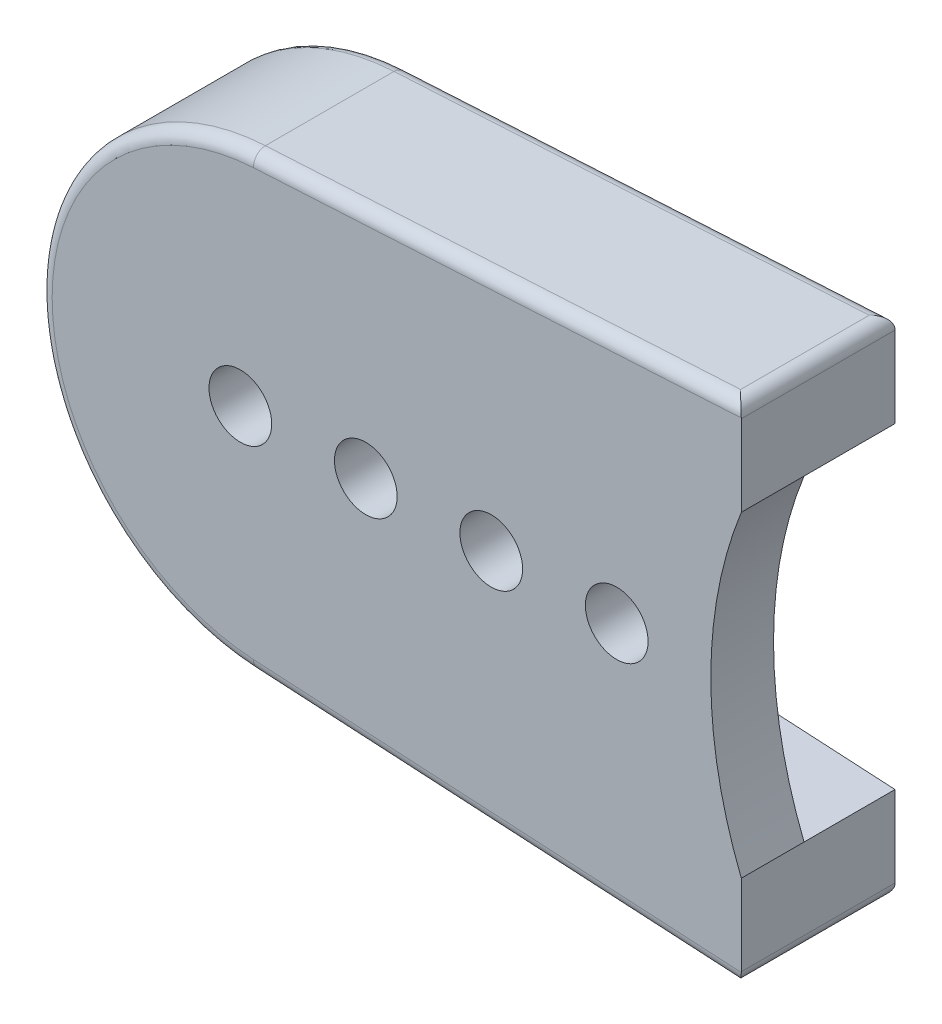
ISO-10303-21;
HEADER;
FILE_DESCRIPTION(('STEP AP214'),'2;1');
FILE_NAME('part.step','',(''),(''),'','','');
FILE_SCHEMA(('AUTOMOTIVE_DESIGN { 1 0 10303 214 1 1 1 1 }'));
ENDSEC;
DATA;
#1=APPLICATION_CONTEXT('core data for automotive mechanical design processes');
#2=APPLICATION_PROTOCOL_DEFINITION('international standard','automotive_design',2000,#1);
#3=PRODUCT_CONTEXT('',#1,'mechanical');
#4=PRODUCT('Part','Part','',(#3));
#5=PRODUCT_RELATED_PRODUCT_CATEGORY('part','',(#4));
#6=PRODUCT_DEFINITION_FORMATION('','',#4);
#7=PRODUCT_DEFINITION_CONTEXT('part definition',#1,'design');
#8=PRODUCT_DEFINITION('design','',#6,#7);
#9=PRODUCT_DEFINITION_SHAPE('','',#8);
#10=(LENGTH_UNIT() NAMED_UNIT(*) SI_UNIT(.MILLI.,.METRE.));
#11=(NAMED_UNIT(*) PLANE_ANGLE_UNIT() SI_UNIT($,.RADIAN.));
#12=(NAMED_UNIT(*) SI_UNIT($,.STERADIAN.) SOLID_ANGLE_UNIT());
#13=UNCERTAINTY_MEASURE_WITH_UNIT(LENGTH_MEASURE(1.E-05),#10,'distance_accuracy_value','');
#14=(GEOMETRIC_REPRESENTATION_CONTEXT(3) GLOBAL_UNCERTAINTY_ASSIGNED_CONTEXT((#13)) GLOBAL_UNIT_ASSIGNED_CONTEXT((#10,
#11,#12)) REPRESENTATION_CONTEXT('',''));
#15=CARTESIAN_POINT('',(0.,0.,0.));
#16=DIRECTION('',(0.,0.,1.));
#17=DIRECTION('',(1.,0.,0.));
#18=AXIS2_PLACEMENT_3D('',#15,#16,#17);
#19=CARTESIAN_POINT('',(0.,0.,1.));
#20=DIRECTION('',(0.,0.,1.));
#21=DIRECTION('',(1.,0.,0.));
#22=AXIS2_PLACEMENT_3D('',#19,#20,#21);
#23=PLANE('',#22);
#24=CARTESIAN_POINT('',(-12.3,0.,1.));
#25=DIRECTION('',(0.,0.,1.));
#26=DIRECTION('',(1.,0.,0.));
#27=AXIS2_PLACEMENT_3D('',#24,#25,#26);
#28=CIRCLE('',#27,0.500000000000001);
#29=CARTESIAN_POINT('',(-11.8,0.,1.));
#30=VERTEX_POINT('',#29);
#31=EDGE_CURVE('E274',#30,#30,#28,.T.);
#32=ORIENTED_EDGE('',*,*,#31,.F.);
#33=EDGE_LOOP('',(#32));
#34=FACE_BOUND('',#33,.T.);
#35=CARTESIAN_POINT('',(-8.3,0.,1.));
#36=DIRECTION('',(0.,0.,1.));
#37=DIRECTION('',(1.,0.,0.));
#38=AXIS2_PLACEMENT_3D('',#35,#36,#37);
#39=CIRCLE('',#38,0.500000000000001);
#40=CARTESIAN_POINT('',(-7.8,0.,1.));
#41=VERTEX_POINT('',#40);
#42=EDGE_CURVE('E286',#41,#41,#39,.T.);
#43=ORIENTED_EDGE('',*,*,#42,.F.);
#44=EDGE_LOOP('',(#43));
#45=FACE_BOUND('',#44,.T.);
#46=DIRECTION('',(0.998452256545436,-0.0556155679583174,0.));
#47=VECTOR('',#46,1.);
#48=CARTESIAN_POINT('',(-0.232086901508914,-4.16659757390032,1.));
#49=LINE('',#48,#47);
#50=CARTESIAN_POINT('',(-14.0890929310583,-3.39473767225448,1.));
#51=VERTEX_POINT('',#50);
#52=CARTESIAN_POINT('',(-6.31379868961076,-3.82783540171158,1.));
#53=VERTEX_POINT('',#52);
#54=EDGE_CURVE('E182',#51,#53,#49,.T.);
#55=ORIENTED_EDGE('',*,*,#54,.T.);
#56=CARTESIAN_POINT('',(-6.51348914091985,-3.81671228811991,1.));
#57=DIRECTION('',(0.,0.,1.));
#58=DIRECTION('',(1.,0.,0.));
#59=AXIS2_PLACEMENT_3D('',#56,#57,#58);
#60=CIRCLE('',#59,0.2);
#61=CARTESIAN_POINT('',(-6.31348914091985,-3.81671228811991,1.));
#62=VERTEX_POINT('',#61);
#63=EDGE_CURVE('E184',#53,#62,#60,.T.);
#64=ORIENTED_EDGE('',*,*,#63,.T.);
#65=DIRECTION('',(0.,-1.,0.));
#66=VECTOR('',#65,1.);
#67=CARTESIAN_POINT('',(-6.31348914091985,0.,1.));
#68=LINE('',#67,#66);
#69=CARTESIAN_POINT('',(-6.31348914091985,-2.52583745864359,1.));
#70=VERTEX_POINT('',#69);
#71=EDGE_CURVE('E162',#70,#62,#68,.T.);
#72=ORIENTED_EDGE('',*,*,#71,.F.);
#73=CARTESIAN_POINT('',(0.,0.,1.));
#74=DIRECTION('',(0.,0.,-1.));
#75=DIRECTION('',(1.,0.,0.));
#76=AXIS2_PLACEMENT_3D('',#73,#74,#75);
#77=CIRCLE('',#76,6.8);
#78=CARTESIAN_POINT('',(-6.31348914091985,2.52583745864359,1.));
#79=VERTEX_POINT('',#78);
#80=EDGE_CURVE('E158',#70,#79,#77,.T.);
#81=ORIENTED_EDGE('',*,*,#80,.T.);
#82=DIRECTION('',(0.,1.,0.));
#83=VECTOR('',#82,1.);
#84=CARTESIAN_POINT('',(-6.31348914091985,0.,1.));
#85=LINE('',#84,#83);
#86=CARTESIAN_POINT('',(-6.31348914091985,3.81671228811991,1.));
#87=VERTEX_POINT('',#86);
#88=EDGE_CURVE('E142',#79,#87,#85,.T.);
#89=ORIENTED_EDGE('',*,*,#88,.T.);
#90=CARTESIAN_POINT('',(-6.51348914091985,3.81671228811991,1.));
#91=DIRECTION('',(0.,0.,1.));
#92=DIRECTION('',(1.,0.,0.));
#93=AXIS2_PLACEMENT_3D('',#90,#91,#92);
#94=CIRCLE('',#93,0.2);
#95=CARTESIAN_POINT('',(-6.31379868961076,3.82783540171157,1.));
#96=VERTEX_POINT('',#95);
#97=EDGE_CURVE('E172',#87,#96,#94,.T.);
#98=ORIENTED_EDGE('',*,*,#97,.T.);
#99=DIRECTION('',(-0.998452256545436,-0.0556155679583176,0.));
#100=VECTOR('',#99,1.);
#101=CARTESIAN_POINT('',(-0.232086901508914,4.16659757390031,1.));
#102=LINE('',#101,#100);
#103=CARTESIAN_POINT('',(-14.0890929310583,3.39473767225448,1.));
#104=VERTEX_POINT('',#103);
#105=EDGE_CURVE('E174',#96,#104,#102,.T.);
#106=ORIENTED_EDGE('',*,*,#105,.T.);
#107=CARTESIAN_POINT('',(-13.9,0.,1.));
#108=DIRECTION('',(0.,0.,1.));
#109=DIRECTION('',(1.,0.,0.));
#110=AXIS2_PLACEMENT_3D('',#107,#108,#109);
#111=CIRCLE('',#110,3.4);
#112=EDGE_CURVE('E180',#104,#51,#111,.T.);
#113=ORIENTED_EDGE('',*,*,#112,.T.);
#114=EDGE_LOOP('',(#55,#64,#72,#81,#89,#98,#106,#113));
#115=FACE_BOUND('',#114,.T.);
#116=CARTESIAN_POINT('',(-10.3,0.,1.));
#117=DIRECTION('',(0.,0.,1.));
#118=DIRECTION('',(1.,0.,0.));
#119=AXIS2_PLACEMENT_3D('',#116,#117,#118);
#120=CIRCLE('',#119,0.500000000000001);
#121=CARTESIAN_POINT('',(-9.8,0.,1.));
#122=VERTEX_POINT('',#121);
#123=EDGE_CURVE('E280',#122,#122,#120,.T.);
#124=ORIENTED_EDGE('',*,*,#123,.F.);
#125=EDGE_LOOP('',(#124));
#126=FACE_BOUND('',#125,.T.);
#127=CARTESIAN_POINT('',(-14.3,0.,1.));
#128=DIRECTION('',(0.,0.,1.));
#129=DIRECTION('',(1.,0.,0.));
#130=AXIS2_PLACEMENT_3D('',#127,#128,#129);
#131=CIRCLE('',#130,0.500000000000001);
#132=CARTESIAN_POINT('',(-13.8,0.,1.));
#133=VERTEX_POINT('',#132);
#134=EDGE_CURVE('E268',#133,#133,#131,.T.);
#135=ORIENTED_EDGE('',*,*,#134,.F.);
#136=EDGE_LOOP('',(#135));
#137=FACE_BOUND('',#136,.T.);
#138=ADVANCED_FACE('F37',(#34,#45,#115,#126,#137),#23,.T.);
#139=CARTESIAN_POINT('',(0.,0.,0.));
#140=DIRECTION('',(0.,0.,1.));
#141=DIRECTION('',(1.,0.,0.));
#142=AXIS2_PLACEMENT_3D('',#139,#140,#141);
#143=PLANE('',#142);
#144=CARTESIAN_POINT('',(0.,0.,0.));
#145=DIRECTION('',(0.,0.,-1.));
#146=DIRECTION('',(1.,0.,0.));
#147=AXIS2_PLACEMENT_3D('',#144,#145,#146);
#148=CIRCLE('',#147,6.8);
#149=CARTESIAN_POINT('',(-6.31348914091985,-2.52583745864359,0.));
#150=VERTEX_POINT('',#149);
#151=CARTESIAN_POINT('',(-6.31348914091985,2.52583745864359,0.));
#152=VERTEX_POINT('',#151);
#153=EDGE_CURVE('E171',#150,#152,#148,.T.);
#154=ORIENTED_EDGE('',*,*,#153,.F.);
#155=DIRECTION('',(0.998452256545436,-0.0556155679583174,0.));
#156=VECTOR('',#155,1.);
#157=CARTESIAN_POINT('',(-14.0167926927125,-2.09674973874542,0.));
#158=LINE('',#157,#156);
#159=CARTESIAN_POINT('',(-14.0167926927125,-2.09674973874542,0.));
#160=VERTEX_POINT('',#159);
#161=EDGE_CURVE('E166',#160,#150,#158,.T.);
#162=ORIENTED_EDGE('',*,*,#161,.F.);
#163=CARTESIAN_POINT('',(-13.9,0.,0.));
#164=DIRECTION('',(0.,0.,1.));
#165=DIRECTION('',(1.,0.,0.));
#166=AXIS2_PLACEMENT_3D('',#163,#164,#165);
#167=CIRCLE('',#166,2.1);
#168=CARTESIAN_POINT('',(-14.0167926927125,2.09674973874541,0.));
#169=VERTEX_POINT('',#168);
#170=EDGE_CURVE('E294',#169,#160,#167,.T.);
#171=ORIENTED_EDGE('',*,*,#170,.F.);
#172=DIRECTION('',(-0.998452256545436,-0.0556155679583176,0.));
#173=VECTOR('',#172,1.);
#174=CARTESIAN_POINT('',(-6.31348914091985,2.52583745864359,0.));
#175=LINE('',#174,#173);
#176=EDGE_CURVE('E292',#152,#169,#175,.T.);
#177=ORIENTED_EDGE('',*,*,#176,.F.);
#178=EDGE_LOOP('',(#154,#162,#171,#177));
#179=FACE_BOUND('',#178,.T.);
#180=CARTESIAN_POINT('',(-8.3,0.,0.));
#181=DIRECTION('',(0.,0.,1.));
#182=DIRECTION('',(1.,0.,0.));
#183=AXIS2_PLACEMENT_3D('',#180,#181,#182);
#184=CIRCLE('',#183,0.500000000000001);
#185=CARTESIAN_POINT('',(-7.8,0.,0.));
#186=VERTEX_POINT('',#185);
#187=EDGE_CURVE('E283',#186,#186,#184,.T.);
#188=ORIENTED_EDGE('',*,*,#187,.T.);
#189=EDGE_LOOP('',(#188));
#190=FACE_BOUND('',#189,.T.);
#191=CARTESIAN_POINT('',(-10.3,0.,0.));
#192=DIRECTION('',(0.,0.,1.));
#193=DIRECTION('',(1.,0.,0.));
#194=AXIS2_PLACEMENT_3D('',#191,#192,#193);
#195=CIRCLE('',#194,0.500000000000001);
#196=CARTESIAN_POINT('',(-9.8,0.,0.));
#197=VERTEX_POINT('',#196);
#198=EDGE_CURVE('E277',#197,#197,#195,.T.);
#199=ORIENTED_EDGE('',*,*,#198,.T.);
#200=EDGE_LOOP('',(#199));
#201=FACE_BOUND('',#200,.T.);
#202=CARTESIAN_POINT('',(-12.3,0.,0.));
#203=DIRECTION('',(0.,0.,1.));
#204=DIRECTION('',(1.,0.,0.));
#205=AXIS2_PLACEMENT_3D('',#202,#203,#204);
#206=CIRCLE('',#205,0.500000000000001);
#207=CARTESIAN_POINT('',(-11.8,0.,0.));
#208=VERTEX_POINT('',#207);
#209=EDGE_CURVE('E271',#208,#208,#206,.T.);
#210=ORIENTED_EDGE('',*,*,#209,.T.);
#211=EDGE_LOOP('',(#210));
#212=FACE_BOUND('',#211,.T.);
#213=CARTESIAN_POINT('',(-14.3,0.,0.));
#214=DIRECTION('',(0.,0.,1.));
#215=DIRECTION('',(1.,0.,0.));
#216=AXIS2_PLACEMENT_3D('',#213,#214,#215);
#217=CIRCLE('',#216,0.500000000000001);
#218=CARTESIAN_POINT('',(-13.8,0.,0.));
#219=VERTEX_POINT('',#218);
#220=EDGE_CURVE('E267',#219,#219,#217,.T.);
#221=ORIENTED_EDGE('',*,*,#220,.T.);
#222=EDGE_LOOP('',(#221));
#223=FACE_BOUND('',#222,.T.);
#224=ADVANCED_FACE('F307',(#179,#190,#201,#212,#223),#143,.F.);
#225=CARTESIAN_POINT('',(0.,0.,1.));
#226=DIRECTION('',(0.,0.,-1.));
#227=DIRECTION('',(-1.,0.,0.));
#228=AXIS2_PLACEMENT_3D('',#225,#226,#227);
#229=CYLINDRICAL_SURFACE('',#228,6.8);
#230=ORIENTED_EDGE('',*,*,#153,.T.);
#231=DIRECTION('',(0.,0.,-1.));
#232=VECTOR('',#231,1.);
#233=CARTESIAN_POINT('',(-6.31348914091985,2.52583745864359,1.));
#234=LINE('',#233,#232);
#235=EDGE_CURVE('E148',#79,#152,#234,.T.);
#236=ORIENTED_EDGE('',*,*,#235,.F.);
#237=ORIENTED_EDGE('',*,*,#80,.F.);
#238=DIRECTION('',(0.,0.,-1.));
#239=VECTOR('',#238,1.);
#240=CARTESIAN_POINT('',(-6.31348914091985,-2.52583745864359,1.));
#241=LINE('',#240,#239);
#242=EDGE_CURVE('E165',#70,#150,#241,.T.);
#243=ORIENTED_EDGE('',*,*,#242,.T.);
#244=EDGE_LOOP('',(#230,#236,#237,#243));
#245=FACE_BOUND('',#244,.T.);
#246=ADVANCED_FACE('F169',(#245),#229,.F.);
#247=CARTESIAN_POINT('',(-8.3,0.,1.));
#248=DIRECTION('',(0.,0.,-1.));
#249=DIRECTION('',(-1.,0.,0.));
#250=AXIS2_PLACEMENT_3D('',#247,#248,#249);
#251=CYLINDRICAL_SURFACE('',#250,0.500000000000001);
#252=ORIENTED_EDGE('',*,*,#42,.T.);
#253=EDGE_LOOP('',(#252));
#254=FACE_BOUND('',#253,.T.);
#255=ORIENTED_EDGE('',*,*,#187,.F.);
#256=EDGE_LOOP('',(#255));
#257=FACE_BOUND('',#256,.T.);
#258=ADVANCED_FACE('F369',(#254,#257),#251,.F.);
#259=CARTESIAN_POINT('',(-10.3,0.,1.));
#260=DIRECTION('',(0.,0.,-1.));
#261=DIRECTION('',(-1.,0.,0.));
#262=AXIS2_PLACEMENT_3D('',#259,#260,#261);
#263=CYLINDRICAL_SURFACE('',#262,0.500000000000001);
#264=ORIENTED_EDGE('',*,*,#123,.T.);
#265=EDGE_LOOP('',(#264));
#266=FACE_BOUND('',#265,.T.);
#267=ORIENTED_EDGE('',*,*,#198,.F.);
#268=EDGE_LOOP('',(#267));
#269=FACE_BOUND('',#268,.T.);
#270=ADVANCED_FACE('F525',(#266,#269),#263,.F.);
#271=CARTESIAN_POINT('',(-12.3,0.,1.));
#272=DIRECTION('',(0.,0.,-1.));
#273=DIRECTION('',(-1.,0.,0.));
#274=AXIS2_PLACEMENT_3D('',#271,#272,#273);
#275=CYLINDRICAL_SURFACE('',#274,0.500000000000001);
#276=ORIENTED_EDGE('',*,*,#31,.T.);
#277=EDGE_LOOP('',(#276));
#278=FACE_BOUND('',#277,.T.);
#279=ORIENTED_EDGE('',*,*,#209,.F.);
#280=EDGE_LOOP('',(#279));
#281=FACE_BOUND('',#280,.T.);
#282=ADVANCED_FACE('F522',(#278,#281),#275,.F.);
#283=CARTESIAN_POINT('',(-14.3,0.,1.));
#284=DIRECTION('',(0.,0.,-1.));
#285=DIRECTION('',(-1.,0.,0.));
#286=AXIS2_PLACEMENT_3D('',#283,#284,#285);
#287=CYLINDRICAL_SURFACE('',#286,0.500000000000001);
#288=ORIENTED_EDGE('',*,*,#134,.T.);
#289=EDGE_LOOP('',(#288));
#290=FACE_BOUND('',#289,.T.);
#291=ORIENTED_EDGE('',*,*,#220,.F.);
#292=EDGE_LOOP('',(#291));
#293=FACE_BOUND('',#292,.T.);
#294=ADVANCED_FACE('F498',(#290,#293),#287,.F.);
#295=CARTESIAN_POINT('',(-0.159786663163101,-2.86860964039125,-15.2355867945463));
#296=DIRECTION('',(-0.0556155679583173,-0.998452256545436,0.));
#297=DIRECTION('',(0.998452256545436,-0.0556155679583173,0.));
#298=AXIS2_PLACEMENT_3D('',#295,#296,#297);
#299=PLANE('',#298);
#300=DIRECTION('',(0.,0.,1.));
#301=VECTOR('',#300,1.);
#302=CARTESIAN_POINT('',(-14.0167926927125,-2.09674973874542,-15.2355867945463));
#303=LINE('',#302,#301);
#304=CARTESIAN_POINT('',(-14.0167926927125,-2.09674973874542,-1.45));
#305=VERTEX_POINT('',#304);
#306=EDGE_CURVE('E258',#305,#160,#303,.T.);
#307=ORIENTED_EDGE('',*,*,#306,.T.);
#308=ORIENTED_EDGE('',*,*,#161,.T.);
#309=DIRECTION('',(0.,0.,1.));
#310=VECTOR('',#309,1.);
#311=CARTESIAN_POINT('',(-6.31348914091985,-2.52583745864359,-15.2355867945463));
#312=LINE('',#311,#310);
#313=CARTESIAN_POINT('',(-6.31348914091985,-2.52583745864359,-1.45));
#314=VERTEX_POINT('',#313);
#315=EDGE_CURVE('E261',#314,#150,#312,.T.);
#316=ORIENTED_EDGE('',*,*,#315,.F.);
#317=DIRECTION('',(0.998452256545436,-0.0556155679583174,0.));
#318=VECTOR('',#317,1.);
#319=CARTESIAN_POINT('',(-0.159786663163102,-2.86860964039125,-1.45));
#320=LINE('',#319,#318);
#321=EDGE_CURVE('E244',#305,#314,#320,.T.);
#322=ORIENTED_EDGE('',*,*,#321,.F.);
#323=EDGE_LOOP('',(#307,#308,#316,#322));
#324=FACE_BOUND('',#323,.T.);
#325=ADVANCED_FACE('F299',(#324),#299,.F.);
#326=CARTESIAN_POINT('',(-0.159786663163102,2.86860964039125,-15.2355867945463));
#327=DIRECTION('',(-0.0556155679583176,0.998452256545436,0.));
#328=DIRECTION('',(-0.998452256545436,-0.0556155679583176,0.));
#329=AXIS2_PLACEMENT_3D('',#326,#327,#328);
#330=PLANE('',#329);
#331=DIRECTION('',(0.,0.,1.));
#332=VECTOR('',#331,1.);
#333=CARTESIAN_POINT('',(-6.31348914091985,2.52583745864359,-15.2355867945463));
#334=LINE('',#333,#332);
#335=CARTESIAN_POINT('',(-6.31348914091985,2.52583745864359,-1.45));
#336=VERTEX_POINT('',#335);
#337=EDGE_CURVE('E253',#336,#152,#334,.T.);
#338=ORIENTED_EDGE('',*,*,#337,.T.);
#339=ORIENTED_EDGE('',*,*,#176,.T.);
#340=DIRECTION('',(0.,0.,1.));
#341=VECTOR('',#340,1.);
#342=CARTESIAN_POINT('',(-14.0167926927125,2.09674973874541,-15.2355867945463));
#343=LINE('',#342,#341);
#344=CARTESIAN_POINT('',(-14.0167926927125,2.09674973874541,-1.45));
#345=VERTEX_POINT('',#344);
#346=EDGE_CURVE('E255',#345,#169,#343,.T.);
#347=ORIENTED_EDGE('',*,*,#346,.F.);
#348=DIRECTION('',(-0.998452256545436,-0.0556155679583176,0.));
#349=VECTOR('',#348,1.);
#350=CARTESIAN_POINT('',(-0.159786663163102,2.86860964039125,-1.45));
#351=LINE('',#350,#349);
#352=EDGE_CURVE('E235',#336,#345,#351,.T.);
#353=ORIENTED_EDGE('',*,*,#352,.F.);
#354=EDGE_LOOP('',(#338,#339,#347,#353));
#355=FACE_BOUND('',#354,.T.);
#356=ADVANCED_FACE('F310',(#355),#330,.F.);
#357=CARTESIAN_POINT('',(-13.9,0.,-15.2355867945463));
#358=DIRECTION('',(0.,0.,1.));
#359=DIRECTION('',(1.,0.,0.));
#360=AXIS2_PLACEMENT_3D('',#357,#358,#359);
#361=CYLINDRICAL_SURFACE('',#360,2.1);
#362=ORIENTED_EDGE('',*,*,#346,.T.);
#363=ORIENTED_EDGE('',*,*,#170,.T.);
#364=ORIENTED_EDGE('',*,*,#306,.F.);
#365=CARTESIAN_POINT('',(-13.9,0.,-1.45));
#366=DIRECTION('',(0.,0.,-1.));
#367=DIRECTION('',(-1.,0.,0.));
#368=AXIS2_PLACEMENT_3D('',#365,#366,#367);
#369=CIRCLE('',#368,2.1);
#370=EDGE_CURVE('E239',#345,#305,#369,.F.);
#371=ORIENTED_EDGE('',*,*,#370,.F.);
#372=EDGE_LOOP('',(#362,#363,#364,#371));
#373=FACE_BOUND('',#372,.T.);
#374=ADVANCED_FACE('F313',(#373),#361,.F.);
#375=CARTESIAN_POINT('',(0.,0.,-1.45));
#376=DIRECTION('',(0.,0.,-1.));
#377=DIRECTION('',(-1.,0.,0.));
#378=AXIS2_PLACEMENT_3D('',#375,#376,#377);
#379=PLANE('',#378);
#380=DIRECTION('',(0.,-1.,0.));
#381=VECTOR('',#380,1.);
#382=CARTESIAN_POINT('',(-6.31348914091985,0.,-1.45));
#383=LINE('',#382,#381);
#384=CARTESIAN_POINT('',(-6.31348914091985,-3.81671228811991,-1.45));
#385=VERTEX_POINT('',#384);
#386=EDGE_CURVE('E154',#314,#385,#383,.T.);
#387=ORIENTED_EDGE('',*,*,#386,.T.);
#388=CARTESIAN_POINT('',(-6.51348914091985,-3.81671228811991,-1.45));
#389=DIRECTION('',(0.,0.,-1.));
#390=DIRECTION('',(-1.,0.,0.));
#391=AXIS2_PLACEMENT_3D('',#388,#389,#390);
#392=CIRCLE('',#391,0.2);
#393=CARTESIAN_POINT('',(-6.31379868961076,-3.82783540171158,-1.45));
#394=VERTEX_POINT('',#393);
#395=EDGE_CURVE('E203',#385,#394,#392,.T.);
#396=ORIENTED_EDGE('',*,*,#395,.T.);
#397=DIRECTION('',(0.998452256545436,-0.0556155679583174,0.));
#398=VECTOR('',#397,1.);
#399=CARTESIAN_POINT('',(-0.232086901508914,-4.16659757390031,-1.45));
#400=LINE('',#399,#398);
#401=CARTESIAN_POINT('',(-14.0890929310583,-3.39473767225449,-1.45));
#402=VERTEX_POINT('',#401);
#403=EDGE_CURVE('E201',#394,#402,#400,.F.);
#404=ORIENTED_EDGE('',*,*,#403,.T.);
#405=CARTESIAN_POINT('',(-13.9,0.,-1.45));
#406=DIRECTION('',(0.,0.,-1.));
#407=DIRECTION('',(-1.,0.,0.));
#408=AXIS2_PLACEMENT_3D('',#405,#406,#407);
#409=CIRCLE('',#408,3.4);
#410=CARTESIAN_POINT('',(-14.0890929310583,3.39473767225448,-1.45));
#411=VERTEX_POINT('',#410);
#412=EDGE_CURVE('E199',#402,#411,#409,.T.);
#413=ORIENTED_EDGE('',*,*,#412,.T.);
#414=DIRECTION('',(-0.998452256545436,-0.0556155679583176,0.));
#415=VECTOR('',#414,1.);
#416=CARTESIAN_POINT('',(-0.232086901508914,4.16659757390031,-1.45));
#417=LINE('',#416,#415);
#418=CARTESIAN_POINT('',(-6.31379868961076,3.82783540171157,-1.45));
#419=VERTEX_POINT('',#418);
#420=EDGE_CURVE('E197',#411,#419,#417,.F.);
#421=ORIENTED_EDGE('',*,*,#420,.T.);
#422=CARTESIAN_POINT('',(-6.51348914091985,3.81671228811991,-1.45));
#423=DIRECTION('',(0.,0.,-1.));
#424=DIRECTION('',(-1.,0.,0.));
#425=AXIS2_PLACEMENT_3D('',#422,#423,#424);
#426=CIRCLE('',#425,0.2);
#427=CARTESIAN_POINT('',(-6.31348914091985,3.81671228811991,-1.45));
#428=VERTEX_POINT('',#427);
#429=EDGE_CURVE('E195',#419,#428,#426,.T.);
#430=ORIENTED_EDGE('',*,*,#429,.T.);
#431=DIRECTION('',(0.,1.,0.));
#432=VECTOR('',#431,1.);
#433=CARTESIAN_POINT('',(-6.31348914091985,0.,-1.45));
#434=LINE('',#433,#432);
#435=EDGE_CURVE('E247',#336,#428,#434,.T.);
#436=ORIENTED_EDGE('',*,*,#435,.F.);
#437=ORIENTED_EDGE('',*,*,#352,.T.);
#438=ORIENTED_EDGE('',*,*,#370,.T.);
#439=ORIENTED_EDGE('',*,*,#321,.T.);
#440=EDGE_LOOP('',(#387,#396,#404,#413,#421,#430,#436,#437,#438,#439));
#441=FACE_BOUND('',#440,.T.);
#442=ADVANCED_FACE('F314',(#441),#379,.T.);
#443=CARTESIAN_POINT('',(-13.9,0.,-15.2355867945463));
#444=DIRECTION('',(0.,0.,1.));
#445=DIRECTION('',(1.,0.,0.));
#446=AXIS2_PLACEMENT_3D('',#443,#444,#445);
#447=CYLINDRICAL_SURFACE('',#446,3.6);
#448=DIRECTION('',(0.,0.,1.));
#449=VECTOR('',#448,1.);
#450=CARTESIAN_POINT('',(-14.1002160446499,-3.59442812356357,-15.2355867945463));
#451=LINE('',#450,#449);
#452=CARTESIAN_POINT('',(-14.1002160446499,-3.59442812356357,-1.25));
#453=VERTEX_POINT('',#452);
#454=CARTESIAN_POINT('',(-14.1002160446499,-3.59442812356357,0.799999999999999));
#455=VERTEX_POINT('',#454);
#456=EDGE_CURVE('E153',#453,#455,#451,.T.);
#457=ORIENTED_EDGE('',*,*,#456,.T.);
#458=CARTESIAN_POINT('',(-13.9,0.,0.799999999999999));
#459=DIRECTION('',(0.,0.,1.));
#460=DIRECTION('',(1.,0.,0.));
#461=AXIS2_PLACEMENT_3D('',#458,#459,#460);
#462=CIRCLE('',#461,3.6);
#463=CARTESIAN_POINT('',(-14.1002160446499,3.59442812356357,0.799999999999999));
#464=VERTEX_POINT('',#463);
#465=EDGE_CURVE('E207',#455,#464,#462,.F.);
#466=ORIENTED_EDGE('',*,*,#465,.T.);
#467=DIRECTION('',(0.,0.,1.));
#468=VECTOR('',#467,1.);
#469=CARTESIAN_POINT('',(-14.1002160446499,3.59442812356357,-15.2355867945463));
#470=LINE('',#469,#468);
#471=CARTESIAN_POINT('',(-14.1002160446499,3.59442812356357,-1.25));
#472=VERTEX_POINT('',#471);
#473=EDGE_CURVE('E265',#472,#464,#470,.T.);
#474=ORIENTED_EDGE('',*,*,#473,.F.);
#475=CARTESIAN_POINT('',(-13.9,0.,-1.25));
#476=DIRECTION('',(0.,0.,-1.));
#477=DIRECTION('',(-1.,0.,0.));
#478=AXIS2_PLACEMENT_3D('',#475,#476,#477);
#479=CIRCLE('',#478,3.6);
#480=EDGE_CURVE('E205',#472,#453,#479,.F.);
#481=ORIENTED_EDGE('',*,*,#480,.T.);
#482=EDGE_LOOP('',(#457,#466,#474,#481));
#483=FACE_BOUND('',#482,.T.);
#484=ADVANCED_FACE('F333',(#483),#447,.T.);
#485=CARTESIAN_POINT('',(-0.243210015100577,-4.3662880252094,-15.2355867945463));
#486=DIRECTION('',(-0.0556155679583174,-0.998452256545436,0.));
#487=DIRECTION('',(0.998452256545436,-0.0556155679583174,0.));
#488=AXIS2_PLACEMENT_3D('',#485,#486,#487);
#489=PLANE('',#488);
#490=DIRECTION('',(0.,0.,1.));
#491=VECTOR('',#490,1.);
#492=CARTESIAN_POINT('',(-6.52461225451151,-4.016402739429,0.999999999999994));
#493=LINE('',#492,#491);
#494=CARTESIAN_POINT('',(-6.52461225451151,-4.016402739429,-1.25));
#495=VERTEX_POINT('',#494);
#496=CARTESIAN_POINT('',(-6.52461225451151,-4.016402739429,0.8));
#497=VERTEX_POINT('',#496);
#498=EDGE_CURVE('E188',#495,#497,#493,.T.);
#499=ORIENTED_EDGE('',*,*,#498,.T.);
#500=DIRECTION('',(0.998452256545436,-0.0556155679583174,0.));
#501=VECTOR('',#500,1.);
#502=CARTESIAN_POINT('',(-0.243210015100577,-4.3662880252094,0.799999999999999));
#503=LINE('',#502,#501);
#504=EDGE_CURVE('E190',#497,#455,#503,.F.);
#505=ORIENTED_EDGE('',*,*,#504,.T.);
#506=ORIENTED_EDGE('',*,*,#456,.F.);
#507=DIRECTION('',(0.998452256545436,-0.0556155679583174,0.));
#508=VECTOR('',#507,1.);
#509=CARTESIAN_POINT('',(-0.243210015100578,-4.3662880252094,-1.25));
#510=LINE('',#509,#508);
#511=EDGE_CURVE('E186',#453,#495,#510,.T.);
#512=ORIENTED_EDGE('',*,*,#511,.T.);
#513=EDGE_LOOP('',(#499,#505,#506,#512));
#514=FACE_BOUND('',#513,.T.);
#515=ADVANCED_FACE('F335',(#514),#489,.T.);
#516=CARTESIAN_POINT('',(-6.31348914091985,0.,-15.2355867945463));
#517=DIRECTION('',(-1.,0.,0.));
#518=DIRECTION('',(0.,-1.,0.));
#519=AXIS2_PLACEMENT_3D('',#516,#517,#518);
#520=PLANE('',#519);
#521=ORIENTED_EDGE('',*,*,#71,.T.);
#522=DIRECTION('',(0.,0.,1.));
#523=VECTOR('',#522,1.);
#524=CARTESIAN_POINT('',(-6.31348914091985,-3.81671228811991,-1.45));
#525=LINE('',#524,#523);
#526=EDGE_CURVE('E193',#62,#385,#525,.F.);
#527=ORIENTED_EDGE('',*,*,#526,.T.);
#528=ORIENTED_EDGE('',*,*,#386,.F.);
#529=ORIENTED_EDGE('',*,*,#315,.T.);
#530=ORIENTED_EDGE('',*,*,#242,.F.);
#531=EDGE_LOOP('',(#521,#527,#528,#529,#530));
#532=FACE_BOUND('',#531,.T.);
#533=ADVANCED_FACE('F442',(#532),#520,.F.);
#534=CARTESIAN_POINT('',(-6.31348914091985,0.,-15.2355867945463));
#535=DIRECTION('',(1.,0.,0.));
#536=DIRECTION('',(0.,0.,-1.));
#537=AXIS2_PLACEMENT_3D('',#534,#535,#536);
#538=PLANE('',#537);
#539=ORIENTED_EDGE('',*,*,#435,.T.);
#540=DIRECTION('',(0.,0.,1.));
#541=VECTOR('',#540,1.);
#542=CARTESIAN_POINT('',(-6.31348914091985,3.81671228811991,-15.2355867945463));
#543=LINE('',#542,#541);
#544=EDGE_CURVE('E11',#428,#87,#543,.T.);
#545=ORIENTED_EDGE('',*,*,#544,.T.);
#546=ORIENTED_EDGE('',*,*,#88,.F.);
#547=ORIENTED_EDGE('',*,*,#235,.T.);
#548=ORIENTED_EDGE('',*,*,#337,.F.);
#549=EDGE_LOOP('',(#539,#545,#546,#547,#548));
#550=FACE_BOUND('',#549,.T.);
#551=ADVANCED_FACE('F145',(#550),#538,.T.);
#552=CARTESIAN_POINT('',(-0.243210015100578,4.3662880252094,-15.2355867945463));
#553=DIRECTION('',(-0.0556155679583176,0.998452256545436,0.));
#554=DIRECTION('',(-0.998452256545436,-0.0556155679583176,0.));
#555=AXIS2_PLACEMENT_3D('',#552,#553,#554);
#556=PLANE('',#555);
#557=ORIENTED_EDGE('',*,*,#473,.T.);
#558=DIRECTION('',(-0.998452256545436,-0.0556155679583176,0.));
#559=VECTOR('',#558,1.);
#560=CARTESIAN_POINT('',(-0.243210015100578,4.3662880252094,0.799999999999999));
#561=LINE('',#560,#559);
#562=CARTESIAN_POINT('',(-6.52461225451151,4.016402739429,0.8));
#563=VERTEX_POINT('',#562);
#564=EDGE_CURVE('E46',#464,#563,#561,.F.);
#565=ORIENTED_EDGE('',*,*,#564,.T.);
#566=DIRECTION('',(0.,0.,1.));
#567=VECTOR('',#566,1.);
#568=CARTESIAN_POINT('',(-6.52461225451151,4.016402739429,-15.2355867945463));
#569=LINE('',#568,#567);
#570=CARTESIAN_POINT('',(-6.52461225451151,4.016402739429,-1.25));
#571=VERTEX_POINT('',#570);
#572=EDGE_CURVE('E54',#563,#571,#569,.F.);
#573=ORIENTED_EDGE('',*,*,#572,.T.);
#574=DIRECTION('',(-0.998452256545436,-0.0556155679583176,0.));
#575=VECTOR('',#574,1.);
#576=CARTESIAN_POINT('',(-0.243210015100579,4.3662880252094,-1.25));
#577=LINE('',#576,#575);
#578=EDGE_CURVE('E210',#571,#472,#577,.T.);
#579=ORIENTED_EDGE('',*,*,#578,.T.);
#580=EDGE_LOOP('',(#557,#565,#573,#579));
#581=FACE_BOUND('',#580,.T.);
#582=ADVANCED_FACE('F347',(#581),#556,.T.);
#583=CARTESIAN_POINT('',(-0.232086901508915,4.16659757390031,-1.25));
#584=DIRECTION('',(-0.998452256545436,-0.0556155679583176,0.));
#585=DIRECTION('',(0.0556155679583176,-0.998452256545436,0.));
#586=AXIS2_PLACEMENT_3D('',#583,#584,#585);
#587=CYLINDRICAL_SURFACE('',#586,0.2);
#588=CARTESIAN_POINT('',(-14.0890929310583,3.39473767225448,-1.25));
#589=DIRECTION('',(-0.998452256545436,-0.0556155679583195,0.));
#590=DIRECTION('',(0.0556155679583195,-0.998452256545436,0.));
#591=AXIS2_PLACEMENT_3D('',#588,#589,#590);
#592=CIRCLE('',#591,0.2);
#593=EDGE_CURVE('E228',#472,#411,#592,.T.);
#594=ORIENTED_EDGE('',*,*,#593,.F.);
#595=ORIENTED_EDGE('',*,*,#578,.F.);
#596=CARTESIAN_POINT('',(-6.51348914091985,3.81671228811991,-1.25));
#597=DIRECTION('',(0.706012361294288,0.0393261452428676,0.707106781186547));
#598=DIRECTION('',(-0.706012361294288,-0.0393261452428676,0.707106781186547));
#599=AXIS2_PLACEMENT_3D('',#596,#597,#598);
#600=ELLIPSE('',#599,0.282842712474619,0.2);
#601=EDGE_CURVE('E41',#419,#571,#600,.T.);
#602=ORIENTED_EDGE('',*,*,#601,.F.);
#603=ORIENTED_EDGE('',*,*,#420,.F.);
#604=EDGE_LOOP('',(#594,#595,#602,#603));
#605=FACE_BOUND('',#604,.T.);
#606=ADVANCED_FACE('F39',(#605),#587,.T.);
#607=CARTESIAN_POINT('',(-6.51348914091985,3.81671228811991,-15.2355867945463));
#608=DIRECTION('',(0.,0.,1.));
#609=DIRECTION('',(1.,0.,0.));
#610=AXIS2_PLACEMENT_3D('',#607,#608,#609);
#611=CYLINDRICAL_SURFACE('',#610,0.2);
#612=ORIENTED_EDGE('',*,*,#601,.T.);
#613=ORIENTED_EDGE('',*,*,#572,.F.);
#614=CARTESIAN_POINT('',(-6.51348914091985,3.81671228811991,0.799999999999997));
#615=DIRECTION('',(-0.706012361294288,-0.0393261452428676,0.707106781186547));
#616=DIRECTION('',(0.706012361294288,0.0393261452428676,0.707106781186547));
#617=AXIS2_PLACEMENT_3D('',#614,#615,#616);
#618=ELLIPSE('',#617,0.282842712474619,0.2);
#619=EDGE_CURVE('E226',#96,#563,#618,.T.);
#620=ORIENTED_EDGE('',*,*,#619,.F.);
#621=ORIENTED_EDGE('',*,*,#97,.F.);
#622=ORIENTED_EDGE('',*,*,#544,.F.);
#623=ORIENTED_EDGE('',*,*,#429,.F.);
#624=EDGE_LOOP('',(#612,#613,#620,#621,#622,#623));
#625=FACE_BOUND('',#624,.T.);
#626=ADVANCED_FACE('F351',(#625),#611,.T.);
#627=CARTESIAN_POINT('',(-13.9,0.,-1.25));
#628=DIRECTION('',(0.,0.,-1.));
#629=DIRECTION('',(-1.,0.,0.));
#630=AXIS2_PLACEMENT_3D('',#627,#628,#629);
#631=TOROIDAL_SURFACE('',#630,3.4,0.2);
#632=ORIENTED_EDGE('',*,*,#593,.T.);
#633=ORIENTED_EDGE('',*,*,#412,.F.);
#634=CARTESIAN_POINT('',(-14.0890929310583,-3.39473767225449,-1.25));
#635=DIRECTION('',(0.998452256545436,-0.0556155679583195,0.));
#636=DIRECTION('',(0.0556155679583195,0.998452256545436,0.));
#637=AXIS2_PLACEMENT_3D('',#634,#635,#636);
#638=CIRCLE('',#637,0.2);
#639=EDGE_CURVE('E223',#453,#402,#638,.T.);
#640=ORIENTED_EDGE('',*,*,#639,.F.);
#641=ORIENTED_EDGE('',*,*,#480,.F.);
#642=EDGE_LOOP('',(#632,#633,#640,#641));
#643=FACE_BOUND('',#642,.T.);
#644=ADVANCED_FACE('F329',(#643),#631,.T.);
#645=CARTESIAN_POINT('',(-0.232086901508914,4.16659757390031,0.8));
#646=DIRECTION('',(-0.998452256545436,-0.0556155679583176,0.));
#647=DIRECTION('',(0.0556155679583176,-0.998452256545436,0.));
#648=AXIS2_PLACEMENT_3D('',#645,#646,#647);
#649=CYLINDRICAL_SURFACE('',#648,0.2);
#650=ORIENTED_EDGE('',*,*,#619,.T.);
#651=ORIENTED_EDGE('',*,*,#564,.F.);
#652=CARTESIAN_POINT('',(-14.0890929310583,3.39473767225448,0.8));
#653=DIRECTION('',(-0.998452256545436,-0.0556155679583195,0.));
#654=DIRECTION('',(0.0556155679583195,-0.998452256545436,0.));
#655=AXIS2_PLACEMENT_3D('',#652,#653,#654);
#656=CIRCLE('',#655,0.2);
#657=EDGE_CURVE('E220',#104,#464,#656,.T.);
#658=ORIENTED_EDGE('',*,*,#657,.F.);
#659=ORIENTED_EDGE('',*,*,#105,.F.);
#660=EDGE_LOOP('',(#650,#651,#658,#659));
#661=FACE_BOUND('',#660,.T.);
#662=ADVANCED_FACE('F349',(#661),#649,.T.);
#663=CARTESIAN_POINT('',(-0.232086901508914,-4.16659757390031,-1.25));
#664=DIRECTION('',(0.998452256545436,-0.0556155679583174,0.));
#665=DIRECTION('',(0.0556155679583174,0.998452256545436,0.));
#666=AXIS2_PLACEMENT_3D('',#663,#664,#665);
#667=CYLINDRICAL_SURFACE('',#666,0.2);
#668=ORIENTED_EDGE('',*,*,#639,.T.);
#669=ORIENTED_EDGE('',*,*,#403,.F.);
#670=CARTESIAN_POINT('',(-6.51348914091985,-3.81671228811991,-1.25));
#671=DIRECTION('',(0.706012361294288,-0.0393261452428675,0.707106781186547));
#672=DIRECTION('',(0.706012361294288,-0.0393261452428675,-0.707106781186547));
#673=AXIS2_PLACEMENT_3D('',#670,#671,#672);
#674=ELLIPSE('',#673,0.282842712474619,0.2);
#675=EDGE_CURVE('E217',#495,#394,#674,.T.);
#676=ORIENTED_EDGE('',*,*,#675,.F.);
#677=ORIENTED_EDGE('',*,*,#511,.F.);
#678=EDGE_LOOP('',(#668,#669,#676,#677));
#679=FACE_BOUND('',#678,.T.);
#680=ADVANCED_FACE('F326',(#679),#667,.T.);
#681=CARTESIAN_POINT('',(-13.9,0.,0.799999999999999));
#682=DIRECTION('',(0.,0.,1.));
#683=DIRECTION('',(1.,0.,0.));
#684=AXIS2_PLACEMENT_3D('',#681,#682,#683);
#685=TOROIDAL_SURFACE('',#684,3.4,0.2);
#686=ORIENTED_EDGE('',*,*,#657,.T.);
#687=ORIENTED_EDGE('',*,*,#465,.F.);
#688=CARTESIAN_POINT('',(-14.0890929310583,-3.39473767225448,0.8));
#689=DIRECTION('',(0.998452256545436,-0.0556155679583194,0.));
#690=DIRECTION('',(0.0556155679583194,0.998452256545436,0.));
#691=AXIS2_PLACEMENT_3D('',#688,#689,#690);
#692=CIRCLE('',#691,0.2);
#693=EDGE_CURVE('E215',#51,#455,#692,.T.);
#694=ORIENTED_EDGE('',*,*,#693,.F.);
#695=ORIENTED_EDGE('',*,*,#112,.F.);
#696=EDGE_LOOP('',(#686,#687,#694,#695));
#697=FACE_BOUND('',#696,.T.);
#698=ADVANCED_FACE('F346',(#697),#685,.T.);
#699=CARTESIAN_POINT('',(-6.51348914091985,-3.81671228811991,-15.2355867945463));
#700=DIRECTION('',(0.,0.,-1.));
#701=DIRECTION('',(-1.,0.,0.));
#702=AXIS2_PLACEMENT_3D('',#699,#700,#701);
#703=CYLINDRICAL_SURFACE('',#702,0.2);
#704=ORIENTED_EDGE('',*,*,#526,.F.);
#705=ORIENTED_EDGE('',*,*,#63,.F.);
#706=CARTESIAN_POINT('',(-6.51348914091985,-3.81671228811991,0.799999999999997));
#707=DIRECTION('',(0.706012361294289,-0.0393261452428675,-0.707106781186547));
#708=DIRECTION('',(-0.706012361294289,0.0393261452428675,-0.707106781186547));
#709=AXIS2_PLACEMENT_3D('',#706,#707,#708);
#710=ELLIPSE('',#709,0.282842712474619,0.2);
#711=EDGE_CURVE('E213',#497,#53,#710,.F.);
#712=ORIENTED_EDGE('',*,*,#711,.F.);
#713=ORIENTED_EDGE('',*,*,#498,.F.);
#714=ORIENTED_EDGE('',*,*,#675,.T.);
#715=ORIENTED_EDGE('',*,*,#395,.F.);
#716=EDGE_LOOP('',(#704,#705,#712,#713,#714,#715));
#717=FACE_BOUND('',#716,.T.);
#718=ADVANCED_FACE('F319',(#717),#703,.T.);
#719=CARTESIAN_POINT('',(-0.232086901508914,-4.16659757390032,0.8));
#720=DIRECTION('',(0.998452256545436,-0.0556155679583174,0.));
#721=DIRECTION('',(0.0556155679583174,0.998452256545436,0.));
#722=AXIS2_PLACEMENT_3D('',#719,#720,#721);
#723=CYLINDRICAL_SURFACE('',#722,0.2);
#724=ORIENTED_EDGE('',*,*,#693,.T.);
#725=ORIENTED_EDGE('',*,*,#504,.F.);
#726=ORIENTED_EDGE('',*,*,#711,.T.);
#727=ORIENTED_EDGE('',*,*,#54,.F.);
#728=EDGE_LOOP('',(#724,#725,#726,#727));
#729=FACE_BOUND('',#728,.T.);
#730=ADVANCED_FACE('F338',(#729),#723,.T.);
#731=CLOSED_SHELL('',(#138,#224,#246,#258,#270,#282,#294,#325,#356,#374,#442,#484,#515,#533,
#551,#582,#606,#626,#644,#662,#680,#698,#718,#730));
#732=MANIFOLD_SOLID_BREP('B2',#731);
#733=ADVANCED_BREP_SHAPE_REPRESENTATION('',(#18,#732),#14);
#734=SHAPE_DEFINITION_REPRESENTATION(#9,#733);
ENDSEC;
END-ISO-10303-21;
